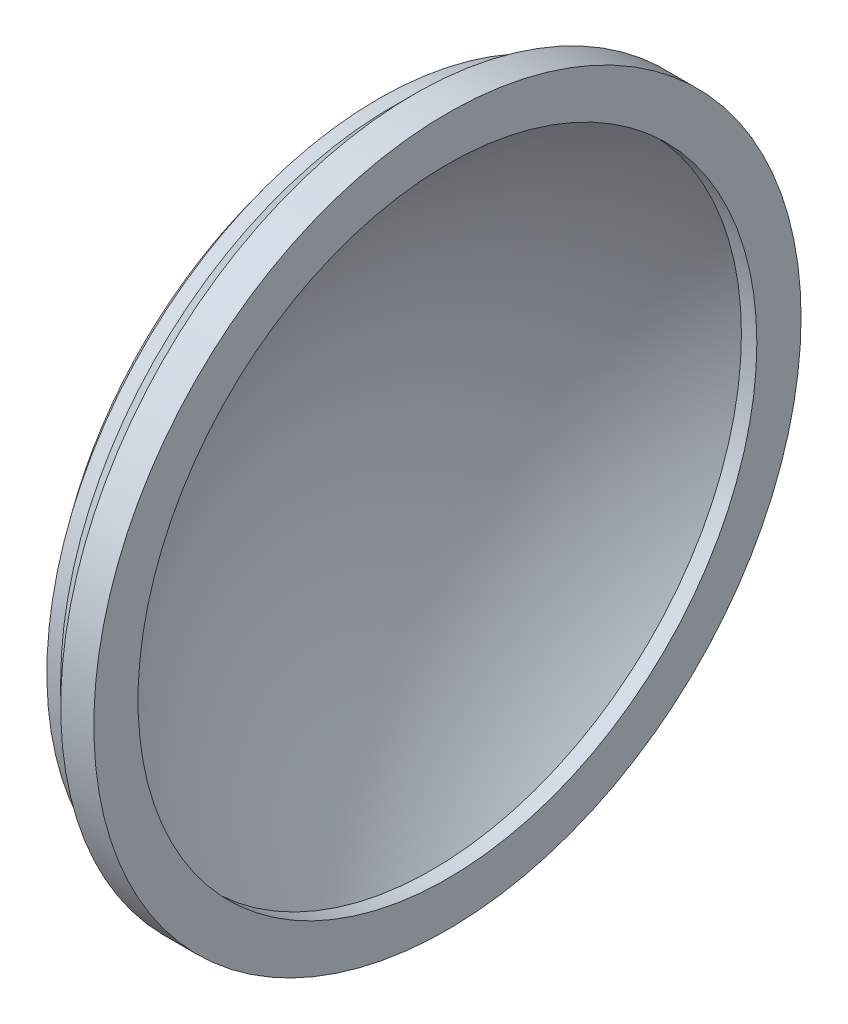
ISO-10303-21;
HEADER;
FILE_DESCRIPTION(('STEP AP214'),'2;1');
FILE_NAME('part.step','',(''),(''),'','','');
FILE_SCHEMA(('AUTOMOTIVE_DESIGN { 1 0 10303 214 1 1 1 1 }'));
ENDSEC;
DATA;
#1=APPLICATION_CONTEXT('core data for automotive mechanical design processes');
#2=APPLICATION_PROTOCOL_DEFINITION('international standard','automotive_design',2000,#1);
#3=PRODUCT_CONTEXT('',#1,'mechanical');
#4=PRODUCT('Part','Part','',(#3));
#5=PRODUCT_RELATED_PRODUCT_CATEGORY('part','',(#4));
#6=PRODUCT_DEFINITION_FORMATION('','',#4);
#7=PRODUCT_DEFINITION_CONTEXT('part definition',#1,'design');
#8=PRODUCT_DEFINITION('design','',#6,#7);
#9=PRODUCT_DEFINITION_SHAPE('','',#8);
#10=(LENGTH_UNIT() NAMED_UNIT(*) SI_UNIT(.MILLI.,.METRE.));
#11=(NAMED_UNIT(*) PLANE_ANGLE_UNIT() SI_UNIT($,.RADIAN.));
#12=(NAMED_UNIT(*) SI_UNIT($,.STERADIAN.) SOLID_ANGLE_UNIT());
#13=UNCERTAINTY_MEASURE_WITH_UNIT(LENGTH_MEASURE(1.E-05),#10,'distance_accuracy_value','');
#14=(GEOMETRIC_REPRESENTATION_CONTEXT(3) GLOBAL_UNCERTAINTY_ASSIGNED_CONTEXT((#13)) GLOBAL_UNIT_ASSIGNED_CONTEXT((#10,
#11,#12)) REPRESENTATION_CONTEXT('',''));
#15=CARTESIAN_POINT('',(0.,0.,0.));
#16=DIRECTION('',(0.,0.,1.));
#17=DIRECTION('',(1.,0.,0.));
#18=AXIS2_PLACEMENT_3D('',#15,#16,#17);
#19=CARTESIAN_POINT('',(45.1545993132812,0.,0.));
#20=DIRECTION('',(1.,0.,0.));
#21=DIRECTION('',(0.,1.,0.));
#22=AXIS2_PLACEMENT_3D('',#19,#20,#21);
#23=SPHERICAL_SURFACE('',#22,95.);
#24=CARTESIAN_POINT('',(-28.5,0.,0.));
#25=DIRECTION('',(1.,0.,0.));
#26=DIRECTION('',(0.,0.,-1.));
#27=AXIS2_PLACEMENT_3D('',#24,#25,#26);
#28=CIRCLE('',#27,60.);
#29=CARTESIAN_POINT('',(-28.5,0.,-60.));
#30=VERTEX_POINT('',#29);
#31=EDGE_CURVE('E59',#30,#30,#28,.T.);
#32=ORIENTED_EDGE('',*,*,#31,.F.);
#33=EDGE_LOOP('',(#32));
#34=FACE_BOUND('',#33,.T.);
#35=ADVANCED_FACE('F37',(#34),#23,.T.);
#36=CARTESIAN_POINT('',(45.1545993132812,0.,0.));
#37=DIRECTION('',(1.,0.,0.));
#38=DIRECTION('',(0.,1.,0.));
#39=AXIS2_PLACEMENT_3D('',#36,#37,#38);
#40=SPHERICAL_SURFACE('',#39,85.);
#41=CARTESIAN_POINT('',(-18.7906898017115,0.,0.));
#42=DIRECTION('',(1.,0.,0.));
#43=DIRECTION('',(0.,0.,-1.));
#44=AXIS2_PLACEMENT_3D('',#41,#42,#43);
#45=CIRCLE('',#44,56.);
#46=CARTESIAN_POINT('',(-18.7906898017115,0.,-56.));
#47=VERTEX_POINT('',#46);
#48=EDGE_CURVE('E10',#47,#47,#45,.T.);
#49=ORIENTED_EDGE('',*,*,#48,.T.);
#50=EDGE_LOOP('',(#49));
#51=FACE_BOUND('',#50,.T.);
#52=ADVANCED_FACE('F67',(#51),#40,.F.);
#53=CARTESIAN_POINT('',(87.4105100797615,0.,0.));
#54=DIRECTION('',(1.,0.,0.));
#55=DIRECTION('',(0.,0.,-1.));
#56=AXIS2_PLACEMENT_3D('',#53,#54,#55);
#57=CYLINDRICAL_SURFACE('',#56,56.);
#58=CARTESIAN_POINT('',(-16.,0.,0.));
#59=DIRECTION('',(1.,0.,0.));
#60=DIRECTION('',(0.,0.,-1.));
#61=AXIS2_PLACEMENT_3D('',#58,#59,#60);
#62=CIRCLE('',#61,56.);
#63=CARTESIAN_POINT('',(-16.,0.,-56.));
#64=VERTEX_POINT('',#63);
#65=EDGE_CURVE('E43',#64,#64,#62,.T.);
#66=ORIENTED_EDGE('',*,*,#65,.T.);
#67=EDGE_LOOP('',(#66));
#68=FACE_BOUND('',#67,.T.);
#69=ORIENTED_EDGE('',*,*,#48,.F.);
#70=EDGE_LOOP('',(#69));
#71=FACE_BOUND('',#70,.T.);
#72=ADVANCED_FACE('F71',(#68,#71),#57,.F.);
#73=CARTESIAN_POINT('',(-16.,64.,0.));
#74=DIRECTION('',(1.,0.,0.));
#75=DIRECTION('',(0.,0.,-1.));
#76=AXIS2_PLACEMENT_3D('',#73,#74,#75);
#77=PLANE('',#76);
#78=CARTESIAN_POINT('',(-16.,0.,0.));
#79=DIRECTION('',(1.,0.,0.));
#80=DIRECTION('',(0.,0.,-1.));
#81=AXIS2_PLACEMENT_3D('',#78,#79,#80);
#82=CIRCLE('',#81,64.);
#83=CARTESIAN_POINT('',(-16.,0.,-64.));
#84=VERTEX_POINT('',#83);
#85=EDGE_CURVE('E47',#84,#84,#82,.T.);
#86=ORIENTED_EDGE('',*,*,#85,.T.);
#87=EDGE_LOOP('',(#86));
#88=FACE_BOUND('',#87,.T.);
#89=ORIENTED_EDGE('',*,*,#65,.F.);
#90=EDGE_LOOP('',(#89));
#91=FACE_BOUND('',#90,.T.);
#92=ADVANCED_FACE('F75',(#88,#91),#77,.T.);
#93=CARTESIAN_POINT('',(87.4105100797615,0.,0.));
#94=DIRECTION('',(1.,0.,0.));
#95=DIRECTION('',(0.,0.,-1.));
#96=AXIS2_PLACEMENT_3D('',#93,#94,#95);
#97=CYLINDRICAL_SURFACE('',#96,64.);
#98=CARTESIAN_POINT('',(-22.,0.,0.));
#99=DIRECTION('',(1.,0.,0.));
#100=DIRECTION('',(0.,0.,-1.));
#101=AXIS2_PLACEMENT_3D('',#98,#99,#100);
#102=CIRCLE('',#101,64.);
#103=CARTESIAN_POINT('',(-22.,0.,-64.));
#104=VERTEX_POINT('',#103);
#105=EDGE_CURVE('E51',#104,#104,#102,.T.);
#106=ORIENTED_EDGE('',*,*,#105,.T.);
#107=EDGE_LOOP('',(#106));
#108=FACE_BOUND('',#107,.T.);
#109=ORIENTED_EDGE('',*,*,#85,.F.);
#110=EDGE_LOOP('',(#109));
#111=FACE_BOUND('',#110,.T.);
#112=ADVANCED_FACE('F80',(#108,#111),#97,.T.);
#113=CARTESIAN_POINT('',(-22.,0.,0.));
#114=DIRECTION('',(1.,0.,0.));
#115=DIRECTION('',(0.,0.,-1.));
#116=AXIS2_PLACEMENT_3D('',#113,#114,#115);
#117=CONICAL_SURFACE('',#116,64.,0.78539816339745);
#118=CARTESIAN_POINT('',(-26.,0.,0.));
#119=DIRECTION('',(1.,0.,0.));
#120=DIRECTION('',(0.,0.,-1.));
#121=AXIS2_PLACEMENT_3D('',#118,#119,#120);
#122=CIRCLE('',#121,60.);
#123=CARTESIAN_POINT('',(-26.,0.,-60.));
#124=VERTEX_POINT('',#123);
#125=EDGE_CURVE('E56',#124,#124,#122,.T.);
#126=ORIENTED_EDGE('',*,*,#125,.T.);
#127=EDGE_LOOP('',(#126));
#128=FACE_BOUND('',#127,.T.);
#129=ORIENTED_EDGE('',*,*,#105,.F.);
#130=EDGE_LOOP('',(#129));
#131=FACE_BOUND('',#130,.T.);
#132=ADVANCED_FACE('F84',(#128,#131),#117,.T.);
#133=CARTESIAN_POINT('',(87.4105100797615,0.,0.));
#134=DIRECTION('',(1.,0.,0.));
#135=DIRECTION('',(0.,0.,-1.));
#136=AXIS2_PLACEMENT_3D('',#133,#134,#135);
#137=CYLINDRICAL_SURFACE('',#136,60.);
#138=ORIENTED_EDGE('',*,*,#31,.T.);
#139=EDGE_LOOP('',(#138));
#140=FACE_BOUND('',#139,.T.);
#141=ORIENTED_EDGE('',*,*,#125,.F.);
#142=EDGE_LOOP('',(#141));
#143=FACE_BOUND('',#142,.T.);
#144=ADVANCED_FACE('F63',(#140,#143),#137,.T.);
#145=CLOSED_SHELL('',(#35,#52,#72,#92,#112,#132,#144));
#146=MANIFOLD_SOLID_BREP('B2',#145);
#147=ADVANCED_BREP_SHAPE_REPRESENTATION('',(#18,#146),#14);
#148=SHAPE_DEFINITION_REPRESENTATION(#9,#147);
ENDSEC;
END-ISO-10303-21;
